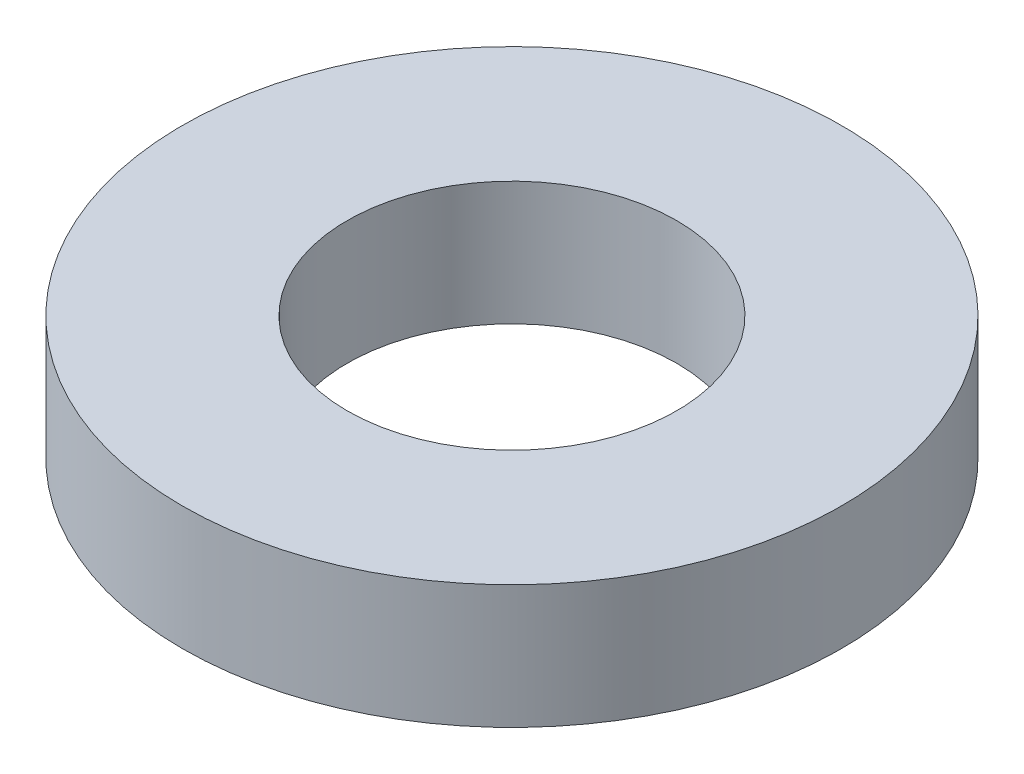
ISO-10303-21;
HEADER;
FILE_DESCRIPTION(('STEP AP214'),'2;1');
FILE_NAME('part.step','',(''),(''),'','','');
FILE_SCHEMA(('AUTOMOTIVE_DESIGN { 1 0 10303 214 1 1 1 1 }'));
ENDSEC;
DATA;
#1=APPLICATION_CONTEXT('core data for automotive mechanical design processes');
#2=APPLICATION_PROTOCOL_DEFINITION('international standard','automotive_design',2000,#1);
#3=PRODUCT_CONTEXT('',#1,'mechanical');
#4=PRODUCT('Part','Part','',(#3));
#5=PRODUCT_RELATED_PRODUCT_CATEGORY('part','',(#4));
#6=PRODUCT_DEFINITION_FORMATION('','',#4);
#7=PRODUCT_DEFINITION_CONTEXT('part definition',#1,'design');
#8=PRODUCT_DEFINITION('design','',#6,#7);
#9=PRODUCT_DEFINITION_SHAPE('','',#8);
#10=(LENGTH_UNIT() NAMED_UNIT(*) SI_UNIT(.MILLI.,.METRE.));
#11=(NAMED_UNIT(*) PLANE_ANGLE_UNIT() SI_UNIT($,.RADIAN.));
#12=(NAMED_UNIT(*) SI_UNIT($,.STERADIAN.) SOLID_ANGLE_UNIT());
#13=UNCERTAINTY_MEASURE_WITH_UNIT(LENGTH_MEASURE(1.E-05),#10,'distance_accuracy_value','');
#14=(GEOMETRIC_REPRESENTATION_CONTEXT(3) GLOBAL_UNCERTAINTY_ASSIGNED_CONTEXT((#13)) GLOBAL_UNIT_ASSIGNED_CONTEXT((#10,
#11,#12)) REPRESENTATION_CONTEXT('',''));
#15=CARTESIAN_POINT('',(0.,0.,0.));
#16=DIRECTION('',(0.,0.,1.));
#17=DIRECTION('',(1.,0.,0.));
#18=AXIS2_PLACEMENT_3D('',#15,#16,#17);
#19=CARTESIAN_POINT('',(0.,0.75,0.));
#20=DIRECTION('',(0.,1.,0.));
#21=DIRECTION('',(0.,0.,1.));
#22=AXIS2_PLACEMENT_3D('',#19,#20,#21);
#23=PLANE('',#22);
#24=CARTESIAN_POINT('',(0.,0.75,0.));
#25=DIRECTION('',(0.,1.,0.));
#26=DIRECTION('',(0.,0.,1.));
#27=AXIS2_PLACEMENT_3D('',#24,#25,#26);
#28=CIRCLE('',#27,2.);
#29=CARTESIAN_POINT('',(0.,0.75,2.));
#30=VERTEX_POINT('',#29);
#31=EDGE_CURVE('E10',#30,#30,#28,.T.);
#32=ORIENTED_EDGE('',*,*,#31,.T.);
#33=EDGE_LOOP('',(#32));
#34=FACE_BOUND('',#33,.T.);
#35=CARTESIAN_POINT('',(0.,0.75,0.));
#36=DIRECTION('',(0.,1.,0.));
#37=DIRECTION('',(0.,0.,1.));
#38=AXIS2_PLACEMENT_3D('',#35,#36,#37);
#39=CIRCLE('',#38,1.);
#40=CARTESIAN_POINT('',(0.,0.75,1.));
#41=VERTEX_POINT('',#40);
#42=EDGE_CURVE('E41',#41,#41,#39,.T.);
#43=ORIENTED_EDGE('',*,*,#42,.F.);
#44=EDGE_LOOP('',(#43));
#45=FACE_BOUND('',#44,.T.);
#46=ADVANCED_FACE('F30',(#34,#45),#23,.T.);
#47=CARTESIAN_POINT('',(0.,0.,0.));
#48=DIRECTION('',(0.,1.,0.));
#49=DIRECTION('',(0.,0.,1.));
#50=AXIS2_PLACEMENT_3D('',#47,#48,#49);
#51=PLANE('',#50);
#52=CARTESIAN_POINT('',(0.,0.,0.));
#53=DIRECTION('',(0.,1.,0.));
#54=DIRECTION('',(0.,0.,1.));
#55=AXIS2_PLACEMENT_3D('',#52,#53,#54);
#56=CIRCLE('',#55,2.);
#57=CARTESIAN_POINT('',(0.,0.,2.));
#58=VERTEX_POINT('',#57);
#59=EDGE_CURVE('E34',#58,#58,#56,.T.);
#60=ORIENTED_EDGE('',*,*,#59,.F.);
#61=EDGE_LOOP('',(#60));
#62=FACE_BOUND('',#61,.T.);
#63=CARTESIAN_POINT('',(0.,0.,0.));
#64=DIRECTION('',(0.,1.,0.));
#65=DIRECTION('',(0.,0.,1.));
#66=AXIS2_PLACEMENT_3D('',#63,#64,#65);
#67=CIRCLE('',#66,1.);
#68=CARTESIAN_POINT('',(0.,0.,1.));
#69=VERTEX_POINT('',#68);
#70=EDGE_CURVE('E43',#69,#69,#67,.T.);
#71=ORIENTED_EDGE('',*,*,#70,.T.);
#72=EDGE_LOOP('',(#71));
#73=FACE_BOUND('',#72,.T.);
#74=ADVANCED_FACE('F53',(#62,#73),#51,.F.);
#75=CARTESIAN_POINT('',(0.,0.75,0.));
#76=DIRECTION('',(0.,-1.,0.));
#77=DIRECTION('',(0.,0.,-1.));
#78=AXIS2_PLACEMENT_3D('',#75,#76,#77);
#79=CYLINDRICAL_SURFACE('',#78,2.);
#80=ORIENTED_EDGE('',*,*,#31,.F.);
#81=EDGE_LOOP('',(#80));
#82=FACE_BOUND('',#81,.T.);
#83=ORIENTED_EDGE('',*,*,#59,.T.);
#84=EDGE_LOOP('',(#83));
#85=FACE_BOUND('',#84,.T.);
#86=ADVANCED_FACE('F32',(#82,#85),#79,.T.);
#87=CARTESIAN_POINT('',(0.,0.75,0.));
#88=DIRECTION('',(0.,-1.,0.));
#89=DIRECTION('',(0.,0.,-1.));
#90=AXIS2_PLACEMENT_3D('',#87,#88,#89);
#91=CYLINDRICAL_SURFACE('',#90,1.);
#92=ORIENTED_EDGE('',*,*,#42,.T.);
#93=EDGE_LOOP('',(#92));
#94=FACE_BOUND('',#93,.T.);
#95=ORIENTED_EDGE('',*,*,#70,.F.);
#96=EDGE_LOOP('',(#95));
#97=FACE_BOUND('',#96,.T.);
#98=ADVANCED_FACE('F49',(#94,#97),#91,.F.);
#99=CLOSED_SHELL('',(#46,#74,#86,#98));
#100=MANIFOLD_SOLID_BREP('B2',#99);
#101=ADVANCED_BREP_SHAPE_REPRESENTATION('',(#18,#100),#14);
#102=SHAPE_DEFINITION_REPRESENTATION(#9,#101);
ENDSEC;
END-ISO-10303-21;
